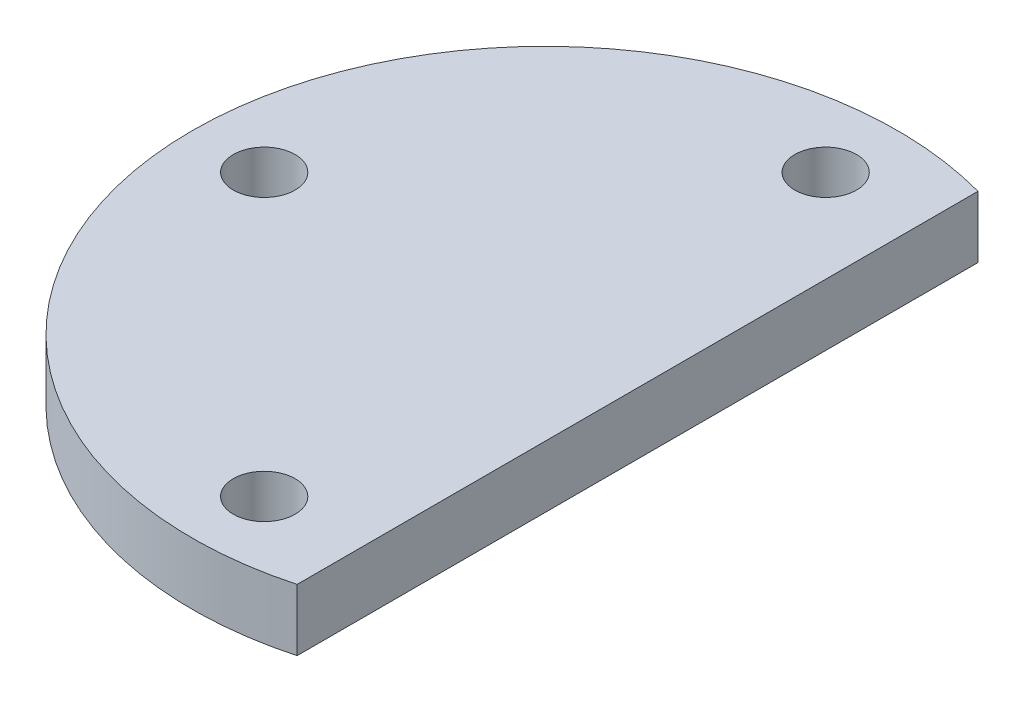
ISO-10303-21;
HEADER;
FILE_DESCRIPTION(('STEP AP214'),'2;1');
FILE_NAME('part.step','',(''),(''),'','','');
FILE_SCHEMA(('AUTOMOTIVE_DESIGN { 1 0 10303 214 1 1 1 1 }'));
ENDSEC;
DATA;
#1=APPLICATION_CONTEXT('core data for automotive mechanical design processes');
#2=APPLICATION_PROTOCOL_DEFINITION('international standard','automotive_design',2000,#1);
#3=PRODUCT_CONTEXT('',#1,'mechanical');
#4=PRODUCT('Part','Part','',(#3));
#5=PRODUCT_RELATED_PRODUCT_CATEGORY('part','',(#4));
#6=PRODUCT_DEFINITION_FORMATION('','',#4);
#7=PRODUCT_DEFINITION_CONTEXT('part definition',#1,'design');
#8=PRODUCT_DEFINITION('design','',#6,#7);
#9=PRODUCT_DEFINITION_SHAPE('','',#8);
#10=(LENGTH_UNIT() NAMED_UNIT(*) SI_UNIT(.MILLI.,.METRE.));
#11=(NAMED_UNIT(*) PLANE_ANGLE_UNIT() SI_UNIT($,.RADIAN.));
#12=(NAMED_UNIT(*) SI_UNIT($,.STERADIAN.) SOLID_ANGLE_UNIT());
#13=UNCERTAINTY_MEASURE_WITH_UNIT(LENGTH_MEASURE(1.E-05),#10,'distance_accuracy_value','');
#14=(GEOMETRIC_REPRESENTATION_CONTEXT(3) GLOBAL_UNCERTAINTY_ASSIGNED_CONTEXT((#13)) GLOBAL_UNIT_ASSIGNED_CONTEXT((#10,
#11,#12)) REPRESENTATION_CONTEXT('',''));
#15=CARTESIAN_POINT('',(0.,0.,0.));
#16=DIRECTION('',(0.,0.,1.));
#17=DIRECTION('',(1.,0.,0.));
#18=AXIS2_PLACEMENT_3D('',#15,#16,#17);
#19=CARTESIAN_POINT('',(-17.1428571428571,3.,0.));
#20=DIRECTION('',(0.,-1.,0.));
#21=DIRECTION('',(0.,0.,-1.));
#22=AXIS2_PLACEMENT_3D('',#19,#20,#21);
#23=PLANE('',#22);
#24=CARTESIAN_POINT('',(-13.64,3.,0.));
#25=DIRECTION('',(0.,1.,0.));
#26=DIRECTION('',(0.,0.,1.));
#27=AXIS2_PLACEMENT_3D('',#24,#25,#26);
#28=CIRCLE('',#27,1.5);
#29=CARTESIAN_POINT('',(-13.64,3.,1.5));
#30=VERTEX_POINT('',#29);
#31=EDGE_CURVE('E67',#30,#30,#28,.T.);
#32=ORIENTED_EDGE('',*,*,#31,.F.);
#33=EDGE_LOOP('',(#32));
#34=FACE_BOUND('',#33,.T.);
#35=CARTESIAN_POINT('',(0.,3.,-13.64));
#36=DIRECTION('',(0.,1.,0.));
#37=DIRECTION('',(0.,0.,1.));
#38=AXIS2_PLACEMENT_3D('',#35,#36,#37);
#39=CIRCLE('',#38,1.5);
#40=CARTESIAN_POINT('',(0.,3.,-12.14));
#41=VERTEX_POINT('',#40);
#42=EDGE_CURVE('E84',#41,#41,#39,.T.);
#43=ORIENTED_EDGE('',*,*,#42,.F.);
#44=EDGE_LOOP('',(#43));
#45=FACE_BOUND('',#44,.T.);
#46=CARTESIAN_POINT('',(0.,3.,13.64));
#47=DIRECTION('',(0.,1.,0.));
#48=DIRECTION('',(0.,0.,1.));
#49=AXIS2_PLACEMENT_3D('',#46,#47,#48);
#50=CIRCLE('',#49,1.5);
#51=CARTESIAN_POINT('',(0.,3.,15.14));
#52=VERTEX_POINT('',#51);
#53=EDGE_CURVE('E118',#52,#52,#50,.T.);
#54=ORIENTED_EDGE('',*,*,#53,.F.);
#55=EDGE_LOOP('',(#54));
#56=FACE_BOUND('',#55,.T.);
#57=CARTESIAN_POINT('',(0.,3.,0.));
#58=DIRECTION('',(0.,-1.,0.));
#59=DIRECTION('',(0.,0.,-1.));
#60=AXIS2_PLACEMENT_3D('',#57,#58,#59);
#61=CIRCLE('',#60,17.1428571428571);
#62=CARTESIAN_POINT('',(4.5,3.,16.5416912986674));
#63=VERTEX_POINT('',#62);
#64=CARTESIAN_POINT('',(4.5,3.,-16.5416912986674));
#65=VERTEX_POINT('',#64);
#66=EDGE_CURVE('E45',#63,#65,#61,.T.);
#67=ORIENTED_EDGE('',*,*,#66,.F.);
#68=DIRECTION('',(0.,0.,1.));
#69=VECTOR('',#68,1.);
#70=CARTESIAN_POINT('',(4.5,3.,-18.4388662903098));
#71=LINE('',#70,#69);
#72=EDGE_CURVE('E62',#65,#63,#71,.T.);
#73=ORIENTED_EDGE('',*,*,#72,.F.);
#74=EDGE_LOOP('',(#67,#73));
#75=FACE_BOUND('',#74,.T.);
#76=ADVANCED_FACE('F38',(#34,#45,#56,#75),#23,.F.);
#77=CARTESIAN_POINT('',(0.,0.,0.));
#78=DIRECTION('',(0.,-1.,0.));
#79=DIRECTION('',(0.,0.,-1.));
#80=AXIS2_PLACEMENT_3D('',#77,#78,#79);
#81=CYLINDRICAL_SURFACE('',#80,17.1428571428571);
#82=ORIENTED_EDGE('',*,*,#66,.T.);
#83=DIRECTION('',(0.,-1.,0.));
#84=VECTOR('',#83,1.);
#85=CARTESIAN_POINT('',(4.5,0.,-16.5416912986674));
#86=LINE('',#85,#84);
#87=CARTESIAN_POINT('',(4.5,0.,-16.5416912986674));
#88=VERTEX_POINT('',#87);
#89=EDGE_CURVE('E59',#65,#88,#86,.T.);
#90=ORIENTED_EDGE('',*,*,#89,.T.);
#91=CARTESIAN_POINT('',(0.,0.,0.));
#92=DIRECTION('',(0.,-1.,0.));
#93=DIRECTION('',(0.,0.,-1.));
#94=AXIS2_PLACEMENT_3D('',#91,#92,#93);
#95=CIRCLE('',#94,17.1428571428571);
#96=CARTESIAN_POINT('',(4.5,0.,16.5416912986674));
#97=VERTEX_POINT('',#96);
#98=EDGE_CURVE('E74',#97,#88,#95,.T.);
#99=ORIENTED_EDGE('',*,*,#98,.F.);
#100=DIRECTION('',(0.,-1.,0.));
#101=VECTOR('',#100,1.);
#102=CARTESIAN_POINT('',(4.5,0.,16.5416912986674));
#103=LINE('',#102,#101);
#104=EDGE_CURVE('E68',#97,#63,#103,.F.);
#105=ORIENTED_EDGE('',*,*,#104,.T.);
#106=EDGE_LOOP('',(#82,#90,#99,#105));
#107=FACE_BOUND('',#106,.T.);
#108=ADVANCED_FACE('F73',(#107),#81,.T.);
#109=CARTESIAN_POINT('',(-14.,0.,0.));
#110=DIRECTION('',(0.,1.,0.));
#111=DIRECTION('',(0.,0.,1.));
#112=AXIS2_PLACEMENT_3D('',#109,#110,#111);
#113=PLANE('',#112);
#114=DIRECTION('',(0.,0.,1.));
#115=VECTOR('',#114,1.);
#116=CARTESIAN_POINT('',(4.5,0.,0.));
#117=LINE('',#116,#115);
#118=EDGE_CURVE('E11',#88,#97,#117,.T.);
#119=ORIENTED_EDGE('',*,*,#118,.T.);
#120=ORIENTED_EDGE('',*,*,#98,.T.);
#121=EDGE_LOOP('',(#119,#120));
#122=FACE_BOUND('',#121,.T.);
#123=CARTESIAN_POINT('',(0.,0.,-13.64));
#124=DIRECTION('',(0.,1.,0.));
#125=DIRECTION('',(0.,0.,1.));
#126=AXIS2_PLACEMENT_3D('',#123,#124,#125);
#127=CIRCLE('',#126,1.5);
#128=CARTESIAN_POINT('',(0.,0.,-12.14));
#129=VERTEX_POINT('',#128);
#130=EDGE_CURVE('E76',#129,#129,#127,.T.);
#131=ORIENTED_EDGE('',*,*,#130,.T.);
#132=EDGE_LOOP('',(#131));
#133=FACE_BOUND('',#132,.T.);
#134=CARTESIAN_POINT('',(0.,0.,13.64));
#135=DIRECTION('',(0.,1.,0.));
#136=DIRECTION('',(0.,0.,1.));
#137=AXIS2_PLACEMENT_3D('',#134,#135,#136);
#138=CIRCLE('',#137,1.5);
#139=CARTESIAN_POINT('',(0.,0.,15.14));
#140=VERTEX_POINT('',#139);
#141=EDGE_CURVE('E83',#140,#140,#138,.T.);
#142=ORIENTED_EDGE('',*,*,#141,.T.);
#143=EDGE_LOOP('',(#142));
#144=FACE_BOUND('',#143,.T.);
#145=CARTESIAN_POINT('',(-13.64,0.,0.));
#146=DIRECTION('',(0.,1.,0.));
#147=DIRECTION('',(0.,0.,1.));
#148=AXIS2_PLACEMENT_3D('',#145,#146,#147);
#149=CIRCLE('',#148,1.5);
#150=CARTESIAN_POINT('',(-13.64,0.,1.5));
#151=VERTEX_POINT('',#150);
#152=EDGE_CURVE('E80',#151,#151,#149,.T.);
#153=ORIENTED_EDGE('',*,*,#152,.T.);
#154=EDGE_LOOP('',(#153));
#155=FACE_BOUND('',#154,.T.);
#156=ADVANCED_FACE('F89',(#122,#133,#144,#155),#113,.F.);
#157=CARTESIAN_POINT('',(-13.64,-7.,0.));
#158=DIRECTION('',(0.,1.,0.));
#159=DIRECTION('',(0.,0.,1.));
#160=AXIS2_PLACEMENT_3D('',#157,#158,#159);
#161=CYLINDRICAL_SURFACE('',#160,1.5);
#162=ORIENTED_EDGE('',*,*,#31,.T.);
#163=EDGE_LOOP('',(#162));
#164=FACE_BOUND('',#163,.T.);
#165=ORIENTED_EDGE('',*,*,#152,.F.);
#166=EDGE_LOOP('',(#165));
#167=FACE_BOUND('',#166,.T.);
#168=ADVANCED_FACE('F102',(#164,#167),#161,.F.);
#169=CARTESIAN_POINT('',(0.,-7.,13.64));
#170=DIRECTION('',(0.,1.,0.));
#171=DIRECTION('',(0.,0.,1.));
#172=AXIS2_PLACEMENT_3D('',#169,#170,#171);
#173=CYLINDRICAL_SURFACE('',#172,1.5);
#174=ORIENTED_EDGE('',*,*,#53,.T.);
#175=EDGE_LOOP('',(#174));
#176=FACE_BOUND('',#175,.T.);
#177=ORIENTED_EDGE('',*,*,#141,.F.);
#178=EDGE_LOOP('',(#177));
#179=FACE_BOUND('',#178,.T.);
#180=ADVANCED_FACE('F94',(#176,#179),#173,.F.);
#181=CARTESIAN_POINT('',(0.,-7.,-13.64));
#182=DIRECTION('',(0.,1.,0.));
#183=DIRECTION('',(0.,0.,1.));
#184=AXIS2_PLACEMENT_3D('',#181,#182,#183);
#185=CYLINDRICAL_SURFACE('',#184,1.5);
#186=ORIENTED_EDGE('',*,*,#42,.T.);
#187=EDGE_LOOP('',(#186));
#188=FACE_BOUND('',#187,.T.);
#189=ORIENTED_EDGE('',*,*,#130,.F.);
#190=EDGE_LOOP('',(#189));
#191=FACE_BOUND('',#190,.T.);
#192=ADVANCED_FACE('F92',(#188,#191),#185,.F.);
#193=CARTESIAN_POINT('',(4.5,-16.,-18.4388662903098));
#194=DIRECTION('',(-1.,0.,0.));
#195=DIRECTION('',(0.,0.,1.));
#196=AXIS2_PLACEMENT_3D('',#193,#194,#195);
#197=PLANE('',#196);
#198=ORIENTED_EDGE('',*,*,#72,.T.);
#199=ORIENTED_EDGE('',*,*,#104,.F.);
#200=ORIENTED_EDGE('',*,*,#118,.F.);
#201=ORIENTED_EDGE('',*,*,#89,.F.);
#202=EDGE_LOOP('',(#198,#199,#200,#201));
#203=FACE_BOUND('',#202,.T.);
#204=ADVANCED_FACE('F61',(#203),#197,.F.);
#205=CLOSED_SHELL('',(#76,#108,#156,#168,#180,#192,#204));
#206=MANIFOLD_SOLID_BREP('B2',#205);
#207=ADVANCED_BREP_SHAPE_REPRESENTATION('',(#18,#206),#14);
#208=SHAPE_DEFINITION_REPRESENTATION(#9,#207);
ENDSEC;
END-ISO-10303-21;
